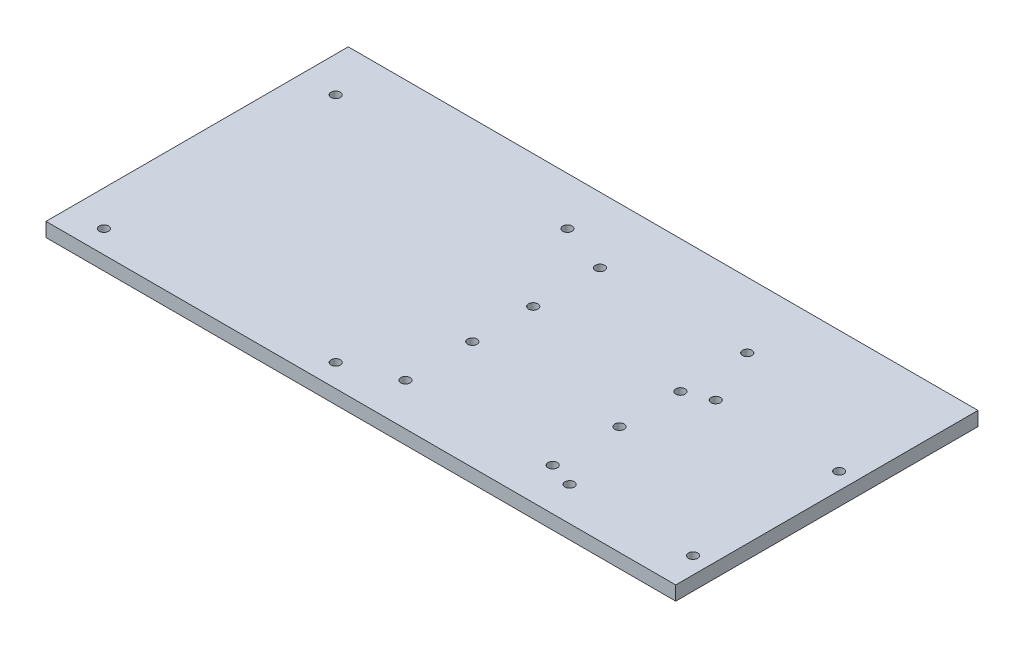
ISO-10303-21;
HEADER;
FILE_DESCRIPTION(('STEP AP214'),'2;1');
FILE_NAME('part.step','',(''),(''),'','','');
FILE_SCHEMA(('AUTOMOTIVE_DESIGN { 1 0 10303 214 1 1 1 1 }'));
ENDSEC;
DATA;
#1=APPLICATION_CONTEXT('core data for automotive mechanical design processes');
#2=APPLICATION_PROTOCOL_DEFINITION('international standard','automotive_design',2000,#1);
#3=PRODUCT_CONTEXT('',#1,'mechanical');
#4=PRODUCT('Part','Part','',(#3));
#5=PRODUCT_RELATED_PRODUCT_CATEGORY('part','',(#4));
#6=PRODUCT_DEFINITION_FORMATION('','',#4);
#7=PRODUCT_DEFINITION_CONTEXT('part definition',#1,'design');
#8=PRODUCT_DEFINITION('design','',#6,#7);
#9=PRODUCT_DEFINITION_SHAPE('','',#8);
#10=(LENGTH_UNIT() NAMED_UNIT(*) SI_UNIT(.MILLI.,.METRE.));
#11=(NAMED_UNIT(*) PLANE_ANGLE_UNIT() SI_UNIT($,.RADIAN.));
#12=(NAMED_UNIT(*) SI_UNIT($,.STERADIAN.) SOLID_ANGLE_UNIT());
#13=UNCERTAINTY_MEASURE_WITH_UNIT(LENGTH_MEASURE(1.E-05),#10,'distance_accuracy_value','');
#14=(GEOMETRIC_REPRESENTATION_CONTEXT(3) GLOBAL_UNCERTAINTY_ASSIGNED_CONTEXT((#13)) GLOBAL_UNIT_ASSIGNED_CONTEXT((#10,
#11,#12)) REPRESENTATION_CONTEXT('',''));
#15=CARTESIAN_POINT('',(0.,0.,0.));
#16=DIRECTION('',(0.,0.,1.));
#17=DIRECTION('',(1.,0.,0.));
#18=AXIS2_PLACEMENT_3D('',#15,#16,#17);
#19=CARTESIAN_POINT('',(125.,5.588,60.));
#20=DIRECTION('',(-1.,0.,0.));
#21=DIRECTION('',(0.,0.,1.));
#22=AXIS2_PLACEMENT_3D('',#19,#20,#21);
#23=PLANE('',#22);
#24=DIRECTION('',(0.,0.,-1.));
#25=VECTOR('',#24,1.);
#26=CARTESIAN_POINT('',(125.,0.,60.));
#27=LINE('',#26,#25);
#28=CARTESIAN_POINT('',(125.,0.,60.));
#29=VERTEX_POINT('',#28);
#30=CARTESIAN_POINT('',(125.,0.,-60.));
#31=VERTEX_POINT('',#30);
#32=EDGE_CURVE('E96',#29,#31,#27,.T.);
#33=ORIENTED_EDGE('',*,*,#32,.T.);
#34=DIRECTION('',(0.,-1.,0.));
#35=VECTOR('',#34,1.);
#36=CARTESIAN_POINT('',(125.,5.588,-60.));
#37=LINE('',#36,#35);
#38=CARTESIAN_POINT('',(125.,5.588,-60.));
#39=VERTEX_POINT('',#38);
#40=EDGE_CURVE('E11',#39,#31,#37,.T.);
#41=ORIENTED_EDGE('',*,*,#40,.F.);
#42=DIRECTION('',(0.,0.,-1.));
#43=VECTOR('',#42,1.);
#44=CARTESIAN_POINT('',(125.,5.588,60.));
#45=LINE('',#44,#43);
#46=CARTESIAN_POINT('',(125.,5.588,60.));
#47=VERTEX_POINT('',#46);
#48=EDGE_CURVE('E84',#47,#39,#45,.T.);
#49=ORIENTED_EDGE('',*,*,#48,.F.);
#50=DIRECTION('',(0.,-1.,0.));
#51=VECTOR('',#50,1.);
#52=CARTESIAN_POINT('',(125.,5.588,60.));
#53=LINE('',#52,#51);
#54=EDGE_CURVE('E92',#47,#29,#53,.T.);
#55=ORIENTED_EDGE('',*,*,#54,.T.);
#56=EDGE_LOOP('',(#33,#41,#49,#55));
#57=FACE_BOUND('',#56,.T.);
#58=ADVANCED_FACE('F33',(#57),#23,.F.);
#59=CARTESIAN_POINT('',(-125.,5.588,-60.));
#60=DIRECTION('',(0.,0.,1.));
#61=DIRECTION('',(1.,0.,0.));
#62=AXIS2_PLACEMENT_3D('',#59,#60,#61);
#63=PLANE('',#62);
#64=DIRECTION('',(-1.,0.,0.));
#65=VECTOR('',#64,1.);
#66=CARTESIAN_POINT('',(-125.,0.,-60.));
#67=LINE('',#66,#65);
#68=CARTESIAN_POINT('',(-125.,0.,-60.));
#69=VERTEX_POINT('',#68);
#70=EDGE_CURVE('E88',#31,#69,#67,.T.);
#71=ORIENTED_EDGE('',*,*,#70,.T.);
#72=DIRECTION('',(0.,-1.,0.));
#73=VECTOR('',#72,1.);
#74=CARTESIAN_POINT('',(-125.,5.588,-60.));
#75=LINE('',#74,#73);
#76=CARTESIAN_POINT('',(-125.,5.588,-60.));
#77=VERTEX_POINT('',#76);
#78=EDGE_CURVE('E41',#77,#69,#75,.T.);
#79=ORIENTED_EDGE('',*,*,#78,.F.);
#80=DIRECTION('',(-1.,0.,0.));
#81=VECTOR('',#80,1.);
#82=CARTESIAN_POINT('',(-125.,5.588,-60.));
#83=LINE('',#82,#81);
#84=EDGE_CURVE('E79',#39,#77,#83,.T.);
#85=ORIENTED_EDGE('',*,*,#84,.F.);
#86=ORIENTED_EDGE('',*,*,#40,.T.);
#87=EDGE_LOOP('',(#71,#79,#85,#86));
#88=FACE_BOUND('',#87,.T.);
#89=ADVANCED_FACE('F87',(#88),#63,.F.);
#90=CARTESIAN_POINT('',(-125.,5.588,60.));
#91=DIRECTION('',(1.,0.,0.));
#92=DIRECTION('',(0.,0.,-1.));
#93=AXIS2_PLACEMENT_3D('',#90,#91,#92);
#94=PLANE('',#93);
#95=DIRECTION('',(0.,0.,1.));
#96=VECTOR('',#95,1.);
#97=CARTESIAN_POINT('',(-125.,0.,60.));
#98=LINE('',#97,#96);
#99=CARTESIAN_POINT('',(-125.,0.,60.));
#100=VERTEX_POINT('',#99);
#101=EDGE_CURVE('E66',#69,#100,#98,.T.);
#102=ORIENTED_EDGE('',*,*,#101,.T.);
#103=DIRECTION('',(0.,-1.,0.));
#104=VECTOR('',#103,1.);
#105=CARTESIAN_POINT('',(-125.,5.588,60.));
#106=LINE('',#105,#104);
#107=CARTESIAN_POINT('',(-125.,5.588,60.));
#108=VERTEX_POINT('',#107);
#109=EDGE_CURVE('E89',#108,#100,#106,.T.);
#110=ORIENTED_EDGE('',*,*,#109,.F.);
#111=DIRECTION('',(0.,0.,1.));
#112=VECTOR('',#111,1.);
#113=CARTESIAN_POINT('',(-125.,5.588,60.));
#114=LINE('',#113,#112);
#115=EDGE_CURVE('E82',#77,#108,#114,.T.);
#116=ORIENTED_EDGE('',*,*,#115,.F.);
#117=ORIENTED_EDGE('',*,*,#78,.T.);
#118=EDGE_LOOP('',(#102,#110,#116,#117));
#119=FACE_BOUND('',#118,.T.);
#120=ADVANCED_FACE('F90',(#119),#94,.F.);
#121=CARTESIAN_POINT('',(-125.,5.588,60.));
#122=DIRECTION('',(0.,0.,-1.));
#123=DIRECTION('',(-1.,0.,0.));
#124=AXIS2_PLACEMENT_3D('',#121,#122,#123);
#125=PLANE('',#124);
#126=DIRECTION('',(1.,0.,0.));
#127=VECTOR('',#126,1.);
#128=CARTESIAN_POINT('',(-125.,0.,60.));
#129=LINE('',#128,#127);
#130=EDGE_CURVE('E72',#100,#29,#129,.T.);
#131=ORIENTED_EDGE('',*,*,#130,.T.);
#132=ORIENTED_EDGE('',*,*,#54,.F.);
#133=DIRECTION('',(1.,0.,0.));
#134=VECTOR('',#133,1.);
#135=CARTESIAN_POINT('',(-125.,5.588,60.));
#136=LINE('',#135,#134);
#137=EDGE_CURVE('E49',#108,#47,#136,.T.);
#138=ORIENTED_EDGE('',*,*,#137,.F.);
#139=ORIENTED_EDGE('',*,*,#109,.T.);
#140=EDGE_LOOP('',(#131,#132,#138,#139));
#141=FACE_BOUND('',#140,.T.);
#142=ADVANCED_FACE('F104',(#141),#125,.F.);
#143=CARTESIAN_POINT('',(0.,5.588,0.));
#144=DIRECTION('',(0.,-1.,0.));
#145=DIRECTION('',(0.,0.,-1.));
#146=AXIS2_PLACEMENT_3D('',#143,#144,#145);
#147=PLANE('',#146);
#148=CARTESIAN_POINT('',(0.975000000000059,5.588,-7.44));
#149=DIRECTION('',(0.,-1.,0.));
#150=DIRECTION('',(0.,0.,-1.));
#151=AXIS2_PLACEMENT_3D('',#148,#149,#150);
#152=CIRCLE('',#151,1.84999999999999);
#153=CARTESIAN_POINT('',(0.975000000000059,5.588,-9.29));
#154=VERTEX_POINT('',#153);
#155=EDGE_CURVE('E199',#154,#154,#152,.T.);
#156=ORIENTED_EDGE('',*,*,#155,.T.);
#157=EDGE_LOOP('',(#156));
#158=FACE_BOUND('',#157,.T.);
#159=CARTESIAN_POINT('',(-18.9999999999999,5.588,-41.));
#160=DIRECTION('',(0.,-1.,0.));
#161=DIRECTION('',(0.,0.,-1.));
#162=AXIS2_PLACEMENT_3D('',#159,#160,#161);
#163=CIRCLE('',#162,1.84999999999999);
#164=CARTESIAN_POINT('',(-18.9999999999999,5.588,-42.85));
#165=VERTEX_POINT('',#164);
#166=EDGE_CURVE('E193',#165,#165,#163,.T.);
#167=ORIENTED_EDGE('',*,*,#166,.T.);
#168=EDGE_LOOP('',(#167));
#169=FACE_BOUND('',#168,.T.);
#170=CARTESIAN_POINT('',(0.975000000000059,5.588,-33.96));
#171=DIRECTION('',(0.,-1.,0.));
#172=DIRECTION('',(0.,0.,-1.));
#173=AXIS2_PLACEMENT_3D('',#170,#171,#172);
#174=CIRCLE('',#173,1.84999999999999);
#175=CARTESIAN_POINT('',(0.975000000000059,5.588,-35.81));
#176=VERTEX_POINT('',#175);
#177=EDGE_CURVE('E187',#176,#176,#174,.T.);
#178=ORIENTED_EDGE('',*,*,#177,.T.);
#179=EDGE_LOOP('',(#178));
#180=FACE_BOUND('',#179,.T.);
#181=CARTESIAN_POINT('',(0.975000000000045,5.588,16.74));
#182=DIRECTION('',(0.,-1.,0.));
#183=DIRECTION('',(0.,0.,-1.));
#184=AXIS2_PLACEMENT_3D('',#181,#182,#183);
#185=CIRCLE('',#184,1.84999999999999);
#186=CARTESIAN_POINT('',(0.975000000000045,5.588,14.89));
#187=VERTEX_POINT('',#186);
#188=EDGE_CURVE('E181',#187,#187,#185,.T.);
#189=ORIENTED_EDGE('',*,*,#188,.T.);
#190=EDGE_LOOP('',(#189));
#191=FACE_BOUND('',#190,.T.);
#192=CARTESIAN_POINT('',(0.975000000000045,5.588,43.26));
#193=DIRECTION('',(0.,-1.,0.));
#194=DIRECTION('',(0.,0.,-1.));
#195=AXIS2_PLACEMENT_3D('',#192,#193,#194);
#196=CIRCLE('',#195,1.84999999999999);
#197=CARTESIAN_POINT('',(0.975000000000045,5.588,41.41));
#198=VERTEX_POINT('',#197);
#199=EDGE_CURVE('E175',#198,#198,#196,.T.);
#200=ORIENTED_EDGE('',*,*,#199,.T.);
#201=EDGE_LOOP('',(#200));
#202=FACE_BOUND('',#201,.T.);
#203=CARTESIAN_POINT('',(-18.9999999999999,5.588,51.));
#204=DIRECTION('',(0.,-1.,0.));
#205=DIRECTION('',(0.,0.,-1.));
#206=AXIS2_PLACEMENT_3D('',#203,#204,#205);
#207=CIRCLE('',#206,1.84999999999999);
#208=CARTESIAN_POINT('',(-18.9999999999999,5.588,49.15));
#209=VERTEX_POINT('',#208);
#210=EDGE_CURVE('E169',#209,#209,#207,.T.);
#211=ORIENTED_EDGE('',*,*,#210,.T.);
#212=EDGE_LOOP('',(#211));
#213=FACE_BOUND('',#212,.T.);
#214=CARTESIAN_POINT('',(-111.,5.588,51.));
#215=DIRECTION('',(0.,-1.,0.));
#216=DIRECTION('',(0.,0.,-1.));
#217=AXIS2_PLACEMENT_3D('',#214,#215,#216);
#218=CIRCLE('',#217,1.84999999999999);
#219=CARTESIAN_POINT('',(-111.,5.588,49.15));
#220=VERTEX_POINT('',#219);
#221=EDGE_CURVE('E163',#220,#220,#218,.T.);
#222=ORIENTED_EDGE('',*,*,#221,.T.);
#223=EDGE_LOOP('',(#222));
#224=FACE_BOUND('',#223,.T.);
#225=CARTESIAN_POINT('',(59.425,5.588,43.26));
#226=DIRECTION('',(0.,-1.,0.));
#227=DIRECTION('',(0.,0.,-1.));
#228=AXIS2_PLACEMENT_3D('',#225,#226,#227);
#229=CIRCLE('',#228,1.85);
#230=CARTESIAN_POINT('',(59.425,5.588,41.41));
#231=VERTEX_POINT('',#230);
#232=EDGE_CURVE('E157',#231,#231,#229,.T.);
#233=ORIENTED_EDGE('',*,*,#232,.T.);
#234=EDGE_LOOP('',(#233));
#235=FACE_BOUND('',#234,.T.);
#236=CARTESIAN_POINT('',(59.4250000000001,5.588,16.74));
#237=DIRECTION('',(0.,-1.,0.));
#238=DIRECTION('',(0.,0.,-1.));
#239=AXIS2_PLACEMENT_3D('',#236,#237,#238);
#240=CIRCLE('',#239,1.85);
#241=CARTESIAN_POINT('',(59.4250000000001,5.588,14.89));
#242=VERTEX_POINT('',#241);
#243=EDGE_CURVE('E151',#242,#242,#240,.T.);
#244=ORIENTED_EDGE('',*,*,#243,.T.);
#245=EDGE_LOOP('',(#244));
#246=FACE_BOUND('',#245,.T.);
#247=CARTESIAN_POINT('',(59.4250000000001,5.588,-7.44));
#248=DIRECTION('',(0.,-1.,0.));
#249=DIRECTION('',(0.,0.,-1.));
#250=AXIS2_PLACEMENT_3D('',#247,#248,#249);
#251=CIRCLE('',#250,1.85);
#252=CARTESIAN_POINT('',(59.4250000000001,5.588,-9.29));
#253=VERTEX_POINT('',#252);
#254=EDGE_CURVE('E145',#253,#253,#251,.T.);
#255=ORIENTED_EDGE('',*,*,#254,.T.);
#256=EDGE_LOOP('',(#255));
#257=FACE_BOUND('',#256,.T.);
#258=CARTESIAN_POINT('',(59.4250000000001,5.588,-33.96));
#259=DIRECTION('',(0.,-1.,0.));
#260=DIRECTION('',(0.,0.,-1.));
#261=AXIS2_PLACEMENT_3D('',#258,#259,#260);
#262=CIRCLE('',#261,1.85);
#263=CARTESIAN_POINT('',(59.4250000000001,5.588,-35.81));
#264=VERTEX_POINT('',#263);
#265=EDGE_CURVE('E139',#264,#264,#262,.T.);
#266=ORIENTED_EDGE('',*,*,#265,.T.);
#267=EDGE_LOOP('',(#266));
#268=FACE_BOUND('',#267,.T.);
#269=CARTESIAN_POINT('',(118.377863273087,5.588,46.5));
#270=DIRECTION('',(0.,-1.,0.));
#271=DIRECTION('',(0.,0.,-1.));
#272=AXIS2_PLACEMENT_3D('',#269,#270,#271);
#273=CIRCLE('',#272,1.84999999999999);
#274=CARTESIAN_POINT('',(118.377863273087,5.588,44.65));
#275=VERTEX_POINT('',#274);
#276=EDGE_CURVE('E133',#275,#275,#273,.T.);
#277=ORIENTED_EDGE('',*,*,#276,.T.);
#278=EDGE_LOOP('',(#277));
#279=FACE_BOUND('',#278,.T.);
#280=CARTESIAN_POINT('',(118.377863273087,5.588,-11.5000000000001));
#281=DIRECTION('',(0.,-1.,0.));
#282=DIRECTION('',(0.,0.,-1.));
#283=AXIS2_PLACEMENT_3D('',#280,#281,#282);
#284=CIRCLE('',#283,1.84999999999999);
#285=CARTESIAN_POINT('',(118.377863273087,5.588,-13.3500000000001));
#286=VERTEX_POINT('',#285);
#287=EDGE_CURVE('E127',#286,#286,#284,.T.);
#288=ORIENTED_EDGE('',*,*,#287,.T.);
#289=EDGE_LOOP('',(#288));
#290=FACE_BOUND('',#289,.T.);
#291=CARTESIAN_POINT('',(69.3778632730866,5.588,-11.5));
#292=DIRECTION('',(0.,-1.,0.));
#293=DIRECTION('',(0.,0.,-1.));
#294=AXIS2_PLACEMENT_3D('',#291,#292,#293);
#295=CIRCLE('',#294,1.84999999999999);
#296=CARTESIAN_POINT('',(69.3778632730866,5.588,-13.35));
#297=VERTEX_POINT('',#296);
#298=EDGE_CURVE('E121',#297,#297,#295,.T.);
#299=ORIENTED_EDGE('',*,*,#298,.T.);
#300=EDGE_LOOP('',(#299));
#301=FACE_BOUND('',#300,.T.);
#302=CARTESIAN_POINT('',(69.3778632730866,5.588,46.5));
#303=DIRECTION('',(0.,-1.,0.));
#304=DIRECTION('',(0.,0.,-1.));
#305=AXIS2_PLACEMENT_3D('',#302,#303,#304);
#306=CIRCLE('',#305,1.84999999999999);
#307=CARTESIAN_POINT('',(69.3778632730866,5.588,44.65));
#308=VERTEX_POINT('',#307);
#309=EDGE_CURVE('E115',#308,#308,#306,.T.);
#310=ORIENTED_EDGE('',*,*,#309,.T.);
#311=EDGE_LOOP('',(#310));
#312=FACE_BOUND('',#311,.T.);
#313=CARTESIAN_POINT('',(-111.,5.588,-41.));
#314=DIRECTION('',(0.,-1.,0.));
#315=DIRECTION('',(0.,0.,-1.));
#316=AXIS2_PLACEMENT_3D('',#313,#314,#315);
#317=CIRCLE('',#316,1.84999999999999);
#318=CARTESIAN_POINT('',(-111.,5.588,-42.85));
#319=VERTEX_POINT('',#318);
#320=EDGE_CURVE('E99',#319,#319,#317,.T.);
#321=ORIENTED_EDGE('',*,*,#320,.T.);
#322=EDGE_LOOP('',(#321));
#323=FACE_BOUND('',#322,.T.);
#324=ORIENTED_EDGE('',*,*,#48,.T.);
#325=ORIENTED_EDGE('',*,*,#84,.T.);
#326=ORIENTED_EDGE('',*,*,#115,.T.);
#327=ORIENTED_EDGE('',*,*,#137,.T.);
#328=EDGE_LOOP('',(#324,#325,#326,#327));
#329=FACE_BOUND('',#328,.T.);
#330=ADVANCED_FACE('F80',(#158,#169,#180,#191,#202,#213,#224,#235,#246,#257,#268,#279,#290,#301,
#312,#323,#329),#147,.F.);
#331=CARTESIAN_POINT('',(0.,0.,0.));
#332=DIRECTION('',(0.,-1.,0.));
#333=DIRECTION('',(0.,0.,-1.));
#334=AXIS2_PLACEMENT_3D('',#331,#332,#333);
#335=PLANE('',#334);
#336=CARTESIAN_POINT('',(0.975000000000059,0.,-7.44));
#337=DIRECTION('',(0.,-1.,0.));
#338=DIRECTION('',(0.,0.,-1.));
#339=AXIS2_PLACEMENT_3D('',#336,#337,#338);
#340=CIRCLE('',#339,1.84999999999999);
#341=CARTESIAN_POINT('',(0.975000000000059,0.,-9.29));
#342=VERTEX_POINT('',#341);
#343=EDGE_CURVE('E202',#342,#342,#340,.T.);
#344=ORIENTED_EDGE('',*,*,#343,.F.);
#345=EDGE_LOOP('',(#344));
#346=FACE_BOUND('',#345,.T.);
#347=CARTESIAN_POINT('',(-18.9999999999999,0.,-41.));
#348=DIRECTION('',(0.,-1.,0.));
#349=DIRECTION('',(0.,0.,-1.));
#350=AXIS2_PLACEMENT_3D('',#347,#348,#349);
#351=CIRCLE('',#350,1.84999999999999);
#352=CARTESIAN_POINT('',(-18.9999999999999,0.,-42.85));
#353=VERTEX_POINT('',#352);
#354=EDGE_CURVE('E196',#353,#353,#351,.T.);
#355=ORIENTED_EDGE('',*,*,#354,.F.);
#356=EDGE_LOOP('',(#355));
#357=FACE_BOUND('',#356,.T.);
#358=CARTESIAN_POINT('',(0.975000000000059,0.,-33.96));
#359=DIRECTION('',(0.,-1.,0.));
#360=DIRECTION('',(0.,0.,-1.));
#361=AXIS2_PLACEMENT_3D('',#358,#359,#360);
#362=CIRCLE('',#361,1.84999999999999);
#363=CARTESIAN_POINT('',(0.975000000000059,0.,-35.81));
#364=VERTEX_POINT('',#363);
#365=EDGE_CURVE('E190',#364,#364,#362,.T.);
#366=ORIENTED_EDGE('',*,*,#365,.F.);
#367=EDGE_LOOP('',(#366));
#368=FACE_BOUND('',#367,.T.);
#369=CARTESIAN_POINT('',(0.975000000000045,0.,16.74));
#370=DIRECTION('',(0.,-1.,0.));
#371=DIRECTION('',(0.,0.,-1.));
#372=AXIS2_PLACEMENT_3D('',#369,#370,#371);
#373=CIRCLE('',#372,1.84999999999999);
#374=CARTESIAN_POINT('',(0.975000000000045,0.,14.89));
#375=VERTEX_POINT('',#374);
#376=EDGE_CURVE('E184',#375,#375,#373,.T.);
#377=ORIENTED_EDGE('',*,*,#376,.F.);
#378=EDGE_LOOP('',(#377));
#379=FACE_BOUND('',#378,.T.);
#380=CARTESIAN_POINT('',(0.975000000000045,0.,43.26));
#381=DIRECTION('',(0.,-1.,0.));
#382=DIRECTION('',(0.,0.,-1.));
#383=AXIS2_PLACEMENT_3D('',#380,#381,#382);
#384=CIRCLE('',#383,1.84999999999999);
#385=CARTESIAN_POINT('',(0.975000000000045,0.,41.41));
#386=VERTEX_POINT('',#385);
#387=EDGE_CURVE('E178',#386,#386,#384,.T.);
#388=ORIENTED_EDGE('',*,*,#387,.F.);
#389=EDGE_LOOP('',(#388));
#390=FACE_BOUND('',#389,.T.);
#391=CARTESIAN_POINT('',(-18.9999999999999,0.,51.));
#392=DIRECTION('',(0.,-1.,0.));
#393=DIRECTION('',(0.,0.,-1.));
#394=AXIS2_PLACEMENT_3D('',#391,#392,#393);
#395=CIRCLE('',#394,1.84999999999999);
#396=CARTESIAN_POINT('',(-18.9999999999999,0.,49.15));
#397=VERTEX_POINT('',#396);
#398=EDGE_CURVE('E172',#397,#397,#395,.T.);
#399=ORIENTED_EDGE('',*,*,#398,.F.);
#400=EDGE_LOOP('',(#399));
#401=FACE_BOUND('',#400,.T.);
#402=CARTESIAN_POINT('',(-111.,0.,51.));
#403=DIRECTION('',(0.,-1.,0.));
#404=DIRECTION('',(0.,0.,-1.));
#405=AXIS2_PLACEMENT_3D('',#402,#403,#404);
#406=CIRCLE('',#405,1.84999999999999);
#407=CARTESIAN_POINT('',(-111.,0.,49.15));
#408=VERTEX_POINT('',#407);
#409=EDGE_CURVE('E166',#408,#408,#406,.T.);
#410=ORIENTED_EDGE('',*,*,#409,.F.);
#411=EDGE_LOOP('',(#410));
#412=FACE_BOUND('',#411,.T.);
#413=CARTESIAN_POINT('',(59.425,0.,43.26));
#414=DIRECTION('',(0.,-1.,0.));
#415=DIRECTION('',(0.,0.,-1.));
#416=AXIS2_PLACEMENT_3D('',#413,#414,#415);
#417=CIRCLE('',#416,1.85);
#418=CARTESIAN_POINT('',(59.425,0.,41.41));
#419=VERTEX_POINT('',#418);
#420=EDGE_CURVE('E160',#419,#419,#417,.T.);
#421=ORIENTED_EDGE('',*,*,#420,.F.);
#422=EDGE_LOOP('',(#421));
#423=FACE_BOUND('',#422,.T.);
#424=CARTESIAN_POINT('',(59.4250000000001,0.,16.74));
#425=DIRECTION('',(0.,-1.,0.));
#426=DIRECTION('',(0.,0.,-1.));
#427=AXIS2_PLACEMENT_3D('',#424,#425,#426);
#428=CIRCLE('',#427,1.85);
#429=CARTESIAN_POINT('',(59.4250000000001,0.,14.89));
#430=VERTEX_POINT('',#429);
#431=EDGE_CURVE('E154',#430,#430,#428,.T.);
#432=ORIENTED_EDGE('',*,*,#431,.F.);
#433=EDGE_LOOP('',(#432));
#434=FACE_BOUND('',#433,.T.);
#435=CARTESIAN_POINT('',(59.4250000000001,0.,-7.44));
#436=DIRECTION('',(0.,-1.,0.));
#437=DIRECTION('',(0.,0.,-1.));
#438=AXIS2_PLACEMENT_3D('',#435,#436,#437);
#439=CIRCLE('',#438,1.85);
#440=CARTESIAN_POINT('',(59.4250000000001,0.,-9.29));
#441=VERTEX_POINT('',#440);
#442=EDGE_CURVE('E148',#441,#441,#439,.T.);
#443=ORIENTED_EDGE('',*,*,#442,.F.);
#444=EDGE_LOOP('',(#443));
#445=FACE_BOUND('',#444,.T.);
#446=CARTESIAN_POINT('',(59.4250000000001,0.,-33.96));
#447=DIRECTION('',(0.,-1.,0.));
#448=DIRECTION('',(0.,0.,-1.));
#449=AXIS2_PLACEMENT_3D('',#446,#447,#448);
#450=CIRCLE('',#449,1.85);
#451=CARTESIAN_POINT('',(59.4250000000001,0.,-35.81));
#452=VERTEX_POINT('',#451);
#453=EDGE_CURVE('E142',#452,#452,#450,.T.);
#454=ORIENTED_EDGE('',*,*,#453,.F.);
#455=EDGE_LOOP('',(#454));
#456=FACE_BOUND('',#455,.T.);
#457=CARTESIAN_POINT('',(118.377863273087,0.,46.5));
#458=DIRECTION('',(0.,-1.,0.));
#459=DIRECTION('',(0.,0.,-1.));
#460=AXIS2_PLACEMENT_3D('',#457,#458,#459);
#461=CIRCLE('',#460,1.84999999999999);
#462=CARTESIAN_POINT('',(118.377863273087,0.,44.65));
#463=VERTEX_POINT('',#462);
#464=EDGE_CURVE('E136',#463,#463,#461,.T.);
#465=ORIENTED_EDGE('',*,*,#464,.F.);
#466=EDGE_LOOP('',(#465));
#467=FACE_BOUND('',#466,.T.);
#468=CARTESIAN_POINT('',(118.377863273087,0.,-11.5000000000001));
#469=DIRECTION('',(0.,-1.,0.));
#470=DIRECTION('',(0.,0.,-1.));
#471=AXIS2_PLACEMENT_3D('',#468,#469,#470);
#472=CIRCLE('',#471,1.84999999999999);
#473=CARTESIAN_POINT('',(118.377863273087,0.,-13.3500000000001));
#474=VERTEX_POINT('',#473);
#475=EDGE_CURVE('E130',#474,#474,#472,.T.);
#476=ORIENTED_EDGE('',*,*,#475,.F.);
#477=EDGE_LOOP('',(#476));
#478=FACE_BOUND('',#477,.T.);
#479=CARTESIAN_POINT('',(69.3778632730866,0.,-11.5));
#480=DIRECTION('',(0.,-1.,0.));
#481=DIRECTION('',(0.,0.,-1.));
#482=AXIS2_PLACEMENT_3D('',#479,#480,#481);
#483=CIRCLE('',#482,1.84999999999999);
#484=CARTESIAN_POINT('',(69.3778632730866,0.,-13.35));
#485=VERTEX_POINT('',#484);
#486=EDGE_CURVE('E124',#485,#485,#483,.T.);
#487=ORIENTED_EDGE('',*,*,#486,.F.);
#488=EDGE_LOOP('',(#487));
#489=FACE_BOUND('',#488,.T.);
#490=CARTESIAN_POINT('',(69.3778632730866,0.,46.5));
#491=DIRECTION('',(0.,-1.,0.));
#492=DIRECTION('',(0.,0.,-1.));
#493=AXIS2_PLACEMENT_3D('',#490,#491,#492);
#494=CIRCLE('',#493,1.84999999999999);
#495=CARTESIAN_POINT('',(69.3778632730866,0.,44.65));
#496=VERTEX_POINT('',#495);
#497=EDGE_CURVE('E118',#496,#496,#494,.T.);
#498=ORIENTED_EDGE('',*,*,#497,.F.);
#499=EDGE_LOOP('',(#498));
#500=FACE_BOUND('',#499,.T.);
#501=CARTESIAN_POINT('',(-111.,0.,-41.));
#502=DIRECTION('',(0.,-1.,0.));
#503=DIRECTION('',(0.,0.,-1.));
#504=AXIS2_PLACEMENT_3D('',#501,#502,#503);
#505=CIRCLE('',#504,1.84999999999999);
#506=CARTESIAN_POINT('',(-111.,0.,-42.85));
#507=VERTEX_POINT('',#506);
#508=EDGE_CURVE('E112',#507,#507,#505,.T.);
#509=ORIENTED_EDGE('',*,*,#508,.F.);
#510=EDGE_LOOP('',(#509));
#511=FACE_BOUND('',#510,.T.);
#512=ORIENTED_EDGE('',*,*,#32,.F.);
#513=ORIENTED_EDGE('',*,*,#130,.F.);
#514=ORIENTED_EDGE('',*,*,#101,.F.);
#515=ORIENTED_EDGE('',*,*,#70,.F.);
#516=EDGE_LOOP('',(#512,#513,#514,#515));
#517=FACE_BOUND('',#516,.T.);
#518=ADVANCED_FACE('F107',(#346,#357,#368,#379,#390,#401,#412,#423,#434,#445,#456,#467,#478,
#489,#500,#511,#517),#335,.T.);
#519=CARTESIAN_POINT('',(-111.,0.,-41.));
#520=DIRECTION('',(0.,-1.,0.));
#521=DIRECTION('',(0.,0.,-1.));
#522=AXIS2_PLACEMENT_3D('',#519,#520,#521);
#523=CYLINDRICAL_SURFACE('',#522,1.84999999999999);
#524=ORIENTED_EDGE('',*,*,#320,.F.);
#525=EDGE_LOOP('',(#524));
#526=FACE_BOUND('',#525,.T.);
#527=ORIENTED_EDGE('',*,*,#508,.T.);
#528=EDGE_LOOP('',(#527));
#529=FACE_BOUND('',#528,.T.);
#530=ADVANCED_FACE('F210',(#526,#529),#523,.F.);
#531=CARTESIAN_POINT('',(69.3778632730866,0.,46.5));
#532=DIRECTION('',(0.,-1.,0.));
#533=DIRECTION('',(0.,0.,-1.));
#534=AXIS2_PLACEMENT_3D('',#531,#532,#533);
#535=CYLINDRICAL_SURFACE('',#534,1.84999999999999);
#536=ORIENTED_EDGE('',*,*,#309,.F.);
#537=EDGE_LOOP('',(#536));
#538=FACE_BOUND('',#537,.T.);
#539=ORIENTED_EDGE('',*,*,#497,.T.);
#540=EDGE_LOOP('',(#539));
#541=FACE_BOUND('',#540,.T.);
#542=ADVANCED_FACE('F243',(#538,#541),#535,.F.);
#543=CARTESIAN_POINT('',(69.3778632730866,0.,-11.5));
#544=DIRECTION('',(0.,-1.,0.));
#545=DIRECTION('',(0.,0.,-1.));
#546=AXIS2_PLACEMENT_3D('',#543,#544,#545);
#547=CYLINDRICAL_SURFACE('',#546,1.84999999999999);
#548=ORIENTED_EDGE('',*,*,#298,.F.);
#549=EDGE_LOOP('',(#548));
#550=FACE_BOUND('',#549,.T.);
#551=ORIENTED_EDGE('',*,*,#486,.T.);
#552=EDGE_LOOP('',(#551));
#553=FACE_BOUND('',#552,.T.);
#554=ADVANCED_FACE('F249',(#550,#553),#547,.F.);
#555=CARTESIAN_POINT('',(118.377863273087,0.,-11.5000000000001));
#556=DIRECTION('',(0.,-1.,0.));
#557=DIRECTION('',(0.,0.,-1.));
#558=AXIS2_PLACEMENT_3D('',#555,#556,#557);
#559=CYLINDRICAL_SURFACE('',#558,1.84999999999999);
#560=ORIENTED_EDGE('',*,*,#287,.F.);
#561=EDGE_LOOP('',(#560));
#562=FACE_BOUND('',#561,.T.);
#563=ORIENTED_EDGE('',*,*,#475,.T.);
#564=EDGE_LOOP('',(#563));
#565=FACE_BOUND('',#564,.T.);
#566=ADVANCED_FACE('F302',(#562,#565),#559,.F.);
#567=CARTESIAN_POINT('',(118.377863273087,0.,46.5));
#568=DIRECTION('',(0.,-1.,0.));
#569=DIRECTION('',(0.,0.,-1.));
#570=AXIS2_PLACEMENT_3D('',#567,#568,#569);
#571=CYLINDRICAL_SURFACE('',#570,1.84999999999999);
#572=ORIENTED_EDGE('',*,*,#276,.F.);
#573=EDGE_LOOP('',(#572));
#574=FACE_BOUND('',#573,.T.);
#575=ORIENTED_EDGE('',*,*,#464,.T.);
#576=EDGE_LOOP('',(#575));
#577=FACE_BOUND('',#576,.T.);
#578=ADVANCED_FACE('F307',(#574,#577),#571,.F.);
#579=CARTESIAN_POINT('',(59.4250000000001,0.,-33.96));
#580=DIRECTION('',(0.,-1.,0.));
#581=DIRECTION('',(0.,0.,-1.));
#582=AXIS2_PLACEMENT_3D('',#579,#580,#581);
#583=CYLINDRICAL_SURFACE('',#582,1.85);
#584=ORIENTED_EDGE('',*,*,#265,.F.);
#585=EDGE_LOOP('',(#584));
#586=FACE_BOUND('',#585,.T.);
#587=ORIENTED_EDGE('',*,*,#453,.T.);
#588=EDGE_LOOP('',(#587));
#589=FACE_BOUND('',#588,.T.);
#590=ADVANCED_FACE('F313',(#586,#589),#583,.F.);
#591=CARTESIAN_POINT('',(59.4250000000001,0.,-7.44));
#592=DIRECTION('',(0.,-1.,0.));
#593=DIRECTION('',(0.,0.,-1.));
#594=AXIS2_PLACEMENT_3D('',#591,#592,#593);
#595=CYLINDRICAL_SURFACE('',#594,1.85);
#596=ORIENTED_EDGE('',*,*,#254,.F.);
#597=EDGE_LOOP('',(#596));
#598=FACE_BOUND('',#597,.T.);
#599=ORIENTED_EDGE('',*,*,#442,.T.);
#600=EDGE_LOOP('',(#599));
#601=FACE_BOUND('',#600,.T.);
#602=ADVANCED_FACE('F317',(#598,#601),#595,.F.);
#603=CARTESIAN_POINT('',(59.4250000000001,0.,16.74));
#604=DIRECTION('',(0.,-1.,0.));
#605=DIRECTION('',(0.,0.,-1.));
#606=AXIS2_PLACEMENT_3D('',#603,#604,#605);
#607=CYLINDRICAL_SURFACE('',#606,1.85);
#608=ORIENTED_EDGE('',*,*,#243,.F.);
#609=EDGE_LOOP('',(#608));
#610=FACE_BOUND('',#609,.T.);
#611=ORIENTED_EDGE('',*,*,#431,.T.);
#612=EDGE_LOOP('',(#611));
#613=FACE_BOUND('',#612,.T.);
#614=ADVANCED_FACE('F321',(#610,#613),#607,.F.);
#615=CARTESIAN_POINT('',(59.425,0.,43.26));
#616=DIRECTION('',(0.,-1.,0.));
#617=DIRECTION('',(0.,0.,-1.));
#618=AXIS2_PLACEMENT_3D('',#615,#616,#617);
#619=CYLINDRICAL_SURFACE('',#618,1.85);
#620=ORIENTED_EDGE('',*,*,#232,.F.);
#621=EDGE_LOOP('',(#620));
#622=FACE_BOUND('',#621,.T.);
#623=ORIENTED_EDGE('',*,*,#420,.T.);
#624=EDGE_LOOP('',(#623));
#625=FACE_BOUND('',#624,.T.);
#626=ADVANCED_FACE('F325',(#622,#625),#619,.F.);
#627=CARTESIAN_POINT('',(-111.,0.,51.));
#628=DIRECTION('',(0.,-1.,0.));
#629=DIRECTION('',(0.,0.,-1.));
#630=AXIS2_PLACEMENT_3D('',#627,#628,#629);
#631=CYLINDRICAL_SURFACE('',#630,1.84999999999999);
#632=ORIENTED_EDGE('',*,*,#221,.F.);
#633=EDGE_LOOP('',(#632));
#634=FACE_BOUND('',#633,.T.);
#635=ORIENTED_EDGE('',*,*,#409,.T.);
#636=EDGE_LOOP('',(#635));
#637=FACE_BOUND('',#636,.T.);
#638=ADVANCED_FACE('F329',(#634,#637),#631,.F.);
#639=CARTESIAN_POINT('',(-18.9999999999999,0.,51.));
#640=DIRECTION('',(0.,-1.,0.));
#641=DIRECTION('',(0.,0.,-1.));
#642=AXIS2_PLACEMENT_3D('',#639,#640,#641);
#643=CYLINDRICAL_SURFACE('',#642,1.84999999999999);
#644=ORIENTED_EDGE('',*,*,#210,.F.);
#645=EDGE_LOOP('',(#644));
#646=FACE_BOUND('',#645,.T.);
#647=ORIENTED_EDGE('',*,*,#398,.T.);
#648=EDGE_LOOP('',(#647));
#649=FACE_BOUND('',#648,.T.);
#650=ADVANCED_FACE('F333',(#646,#649),#643,.F.);
#651=CARTESIAN_POINT('',(0.975000000000045,0.,43.26));
#652=DIRECTION('',(0.,-1.,0.));
#653=DIRECTION('',(0.,0.,-1.));
#654=AXIS2_PLACEMENT_3D('',#651,#652,#653);
#655=CYLINDRICAL_SURFACE('',#654,1.84999999999999);
#656=ORIENTED_EDGE('',*,*,#199,.F.);
#657=EDGE_LOOP('',(#656));
#658=FACE_BOUND('',#657,.T.);
#659=ORIENTED_EDGE('',*,*,#387,.T.);
#660=EDGE_LOOP('',(#659));
#661=FACE_BOUND('',#660,.T.);
#662=ADVANCED_FACE('F337',(#658,#661),#655,.F.);
#663=CARTESIAN_POINT('',(0.975000000000045,0.,16.74));
#664=DIRECTION('',(0.,-1.,0.));
#665=DIRECTION('',(0.,0.,-1.));
#666=AXIS2_PLACEMENT_3D('',#663,#664,#665);
#667=CYLINDRICAL_SURFACE('',#666,1.84999999999999);
#668=ORIENTED_EDGE('',*,*,#188,.F.);
#669=EDGE_LOOP('',(#668));
#670=FACE_BOUND('',#669,.T.);
#671=ORIENTED_EDGE('',*,*,#376,.T.);
#672=EDGE_LOOP('',(#671));
#673=FACE_BOUND('',#672,.T.);
#674=ADVANCED_FACE('F341',(#670,#673),#667,.F.);
#675=CARTESIAN_POINT('',(0.975000000000059,0.,-33.96));
#676=DIRECTION('',(0.,-1.,0.));
#677=DIRECTION('',(0.,0.,-1.));
#678=AXIS2_PLACEMENT_3D('',#675,#676,#677);
#679=CYLINDRICAL_SURFACE('',#678,1.84999999999999);
#680=ORIENTED_EDGE('',*,*,#177,.F.);
#681=EDGE_LOOP('',(#680));
#682=FACE_BOUND('',#681,.T.);
#683=ORIENTED_EDGE('',*,*,#365,.T.);
#684=EDGE_LOOP('',(#683));
#685=FACE_BOUND('',#684,.T.);
#686=ADVANCED_FACE('F345',(#682,#685),#679,.F.);
#687=CARTESIAN_POINT('',(-18.9999999999999,0.,-41.));
#688=DIRECTION('',(0.,-1.,0.));
#689=DIRECTION('',(0.,0.,-1.));
#690=AXIS2_PLACEMENT_3D('',#687,#688,#689);
#691=CYLINDRICAL_SURFACE('',#690,1.84999999999999);
#692=ORIENTED_EDGE('',*,*,#166,.F.);
#693=EDGE_LOOP('',(#692));
#694=FACE_BOUND('',#693,.T.);
#695=ORIENTED_EDGE('',*,*,#354,.T.);
#696=EDGE_LOOP('',(#695));
#697=FACE_BOUND('',#696,.T.);
#698=ADVANCED_FACE('F349',(#694,#697),#691,.F.);
#699=CARTESIAN_POINT('',(0.975000000000059,0.,-7.44));
#700=DIRECTION('',(0.,-1.,0.));
#701=DIRECTION('',(0.,0.,-1.));
#702=AXIS2_PLACEMENT_3D('',#699,#700,#701);
#703=CYLINDRICAL_SURFACE('',#702,1.84999999999999);
#704=ORIENTED_EDGE('',*,*,#155,.F.);
#705=EDGE_LOOP('',(#704));
#706=FACE_BOUND('',#705,.T.);
#707=ORIENTED_EDGE('',*,*,#343,.T.);
#708=EDGE_LOOP('',(#707));
#709=FACE_BOUND('',#708,.T.);
#710=ADVANCED_FACE('F206',(#706,#709),#703,.F.);
#711=CLOSED_SHELL('',(#58,#89,#120,#142,#330,#518,#530,#542,#554,#566,#578,#590,#602,#614,#626,
#638,#650,#662,#674,#686,#698,#710));
#712=MANIFOLD_SOLID_BREP('B2',#711);
#713=ADVANCED_BREP_SHAPE_REPRESENTATION('',(#18,#712),#14);
#714=SHAPE_DEFINITION_REPRESENTATION(#9,#713);
ENDSEC;
END-ISO-10303-21;
